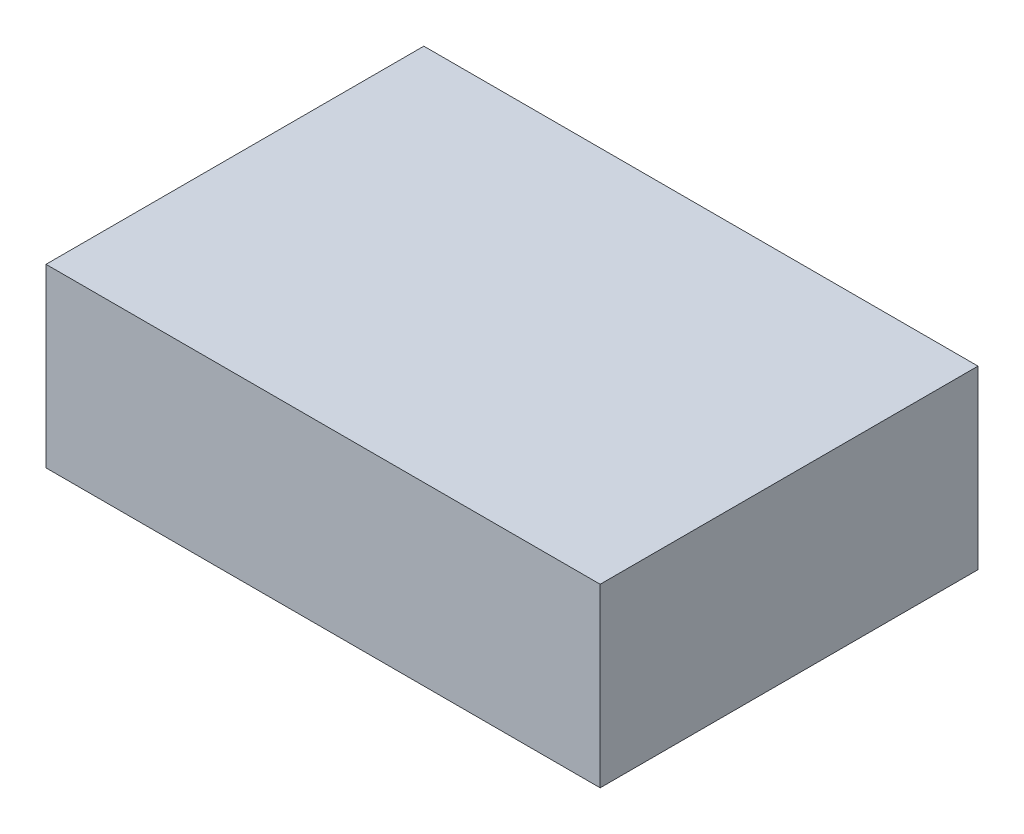
ISO-10303-21;
HEADER;
FILE_DESCRIPTION(('STEP AP214'),'2;1');
FILE_NAME('part.step','',(''),(''),'','','');
FILE_SCHEMA(('AUTOMOTIVE_DESIGN { 1 0 10303 214 1 1 1 1 }'));
ENDSEC;
DATA;
#1=APPLICATION_CONTEXT('core data for automotive mechanical design processes');
#2=APPLICATION_PROTOCOL_DEFINITION('international standard','automotive_design',2000,#1);
#3=PRODUCT_CONTEXT('',#1,'mechanical');
#4=PRODUCT('Part','Part','',(#3));
#5=PRODUCT_RELATED_PRODUCT_CATEGORY('part','',(#4));
#6=PRODUCT_DEFINITION_FORMATION('','',#4);
#7=PRODUCT_DEFINITION_CONTEXT('part definition',#1,'design');
#8=PRODUCT_DEFINITION('design','',#6,#7);
#9=PRODUCT_DEFINITION_SHAPE('','',#8);
#10=(LENGTH_UNIT() NAMED_UNIT(*) SI_UNIT(.MILLI.,.METRE.));
#11=(NAMED_UNIT(*) PLANE_ANGLE_UNIT() SI_UNIT($,.RADIAN.));
#12=(NAMED_UNIT(*) SI_UNIT($,.STERADIAN.) SOLID_ANGLE_UNIT());
#13=UNCERTAINTY_MEASURE_WITH_UNIT(LENGTH_MEASURE(1.E-05),#10,'distance_accuracy_value','');
#14=(GEOMETRIC_REPRESENTATION_CONTEXT(3) GLOBAL_UNCERTAINTY_ASSIGNED_CONTEXT((#13)) GLOBAL_UNIT_ASSIGNED_CONTEXT((#10,
#11,#12)) REPRESENTATION_CONTEXT('',''));
#15=CARTESIAN_POINT('',(0.,0.,0.));
#16=DIRECTION('',(0.,0.,1.));
#17=DIRECTION('',(1.,0.,0.));
#18=AXIS2_PLACEMENT_3D('',#15,#16,#17);
#19=CARTESIAN_POINT('',(-11.,3.5,15.));
#20=DIRECTION('',(1.,0.,0.));
#21=DIRECTION('',(0.,0.,-1.));
#22=AXIS2_PLACEMENT_3D('',#19,#20,#21);
#23=PLANE('',#22);
#24=DIRECTION('',(0.,-1.,0.));
#25=VECTOR('',#24,1.);
#26=CARTESIAN_POINT('',(-11.,3.5,0.));
#27=LINE('',#26,#25);
#28=CARTESIAN_POINT('',(-11.,3.5,0.));
#29=VERTEX_POINT('',#28);
#30=CARTESIAN_POINT('',(-11.,-3.5,0.));
#31=VERTEX_POINT('',#30);
#32=EDGE_CURVE('E100',#29,#31,#27,.T.);
#33=ORIENTED_EDGE('',*,*,#32,.T.);
#34=DIRECTION('',(0.,0.,-1.));
#35=VECTOR('',#34,1.);
#36=CARTESIAN_POINT('',(-11.,-3.5,15.));
#37=LINE('',#36,#35);
#38=CARTESIAN_POINT('',(-11.,-3.5,15.));
#39=VERTEX_POINT('',#38);
#40=EDGE_CURVE('E11',#39,#31,#37,.T.);
#41=ORIENTED_EDGE('',*,*,#40,.F.);
#42=DIRECTION('',(0.,-1.,0.));
#43=VECTOR('',#42,1.);
#44=CARTESIAN_POINT('',(-11.,3.5,15.));
#45=LINE('',#44,#43);
#46=CARTESIAN_POINT('',(-11.,3.5,15.));
#47=VERTEX_POINT('',#46);
#48=EDGE_CURVE('E88',#47,#39,#45,.T.);
#49=ORIENTED_EDGE('',*,*,#48,.F.);
#50=DIRECTION('',(0.,0.,-1.));
#51=VECTOR('',#50,1.);
#52=CARTESIAN_POINT('',(-11.,3.5,15.));
#53=LINE('',#52,#51);
#54=EDGE_CURVE('E96',#47,#29,#53,.T.);
#55=ORIENTED_EDGE('',*,*,#54,.T.);
#56=EDGE_LOOP('',(#33,#41,#49,#55));
#57=FACE_BOUND('',#56,.T.);
#58=ADVANCED_FACE('F37',(#57),#23,.F.);
#59=CARTESIAN_POINT('',(-11.,-3.5,15.));
#60=DIRECTION('',(0.,1.,0.));
#61=DIRECTION('',(0.,0.,1.));
#62=AXIS2_PLACEMENT_3D('',#59,#60,#61);
#63=PLANE('',#62);
#64=DIRECTION('',(1.,0.,0.));
#65=VECTOR('',#64,1.);
#66=CARTESIAN_POINT('',(-11.,-3.5,0.));
#67=LINE('',#66,#65);
#68=CARTESIAN_POINT('',(11.,-3.5,0.));
#69=VERTEX_POINT('',#68);
#70=EDGE_CURVE('E92',#31,#69,#67,.T.);
#71=ORIENTED_EDGE('',*,*,#70,.T.);
#72=DIRECTION('',(0.,0.,-1.));
#73=VECTOR('',#72,1.);
#74=CARTESIAN_POINT('',(11.,-3.5,15.));
#75=LINE('',#74,#73);
#76=CARTESIAN_POINT('',(11.,-3.5,15.));
#77=VERTEX_POINT('',#76);
#78=EDGE_CURVE('E45',#77,#69,#75,.T.);
#79=ORIENTED_EDGE('',*,*,#78,.F.);
#80=DIRECTION('',(1.,0.,0.));
#81=VECTOR('',#80,1.);
#82=CARTESIAN_POINT('',(-11.,-3.5,15.));
#83=LINE('',#82,#81);
#84=EDGE_CURVE('E83',#39,#77,#83,.T.);
#85=ORIENTED_EDGE('',*,*,#84,.F.);
#86=ORIENTED_EDGE('',*,*,#40,.T.);
#87=EDGE_LOOP('',(#71,#79,#85,#86));
#88=FACE_BOUND('',#87,.T.);
#89=ADVANCED_FACE('F91',(#88),#63,.F.);
#90=CARTESIAN_POINT('',(11.,-3.5,15.));
#91=DIRECTION('',(-1.,0.,0.));
#92=DIRECTION('',(0.,0.,1.));
#93=AXIS2_PLACEMENT_3D('',#90,#91,#92);
#94=PLANE('',#93);
#95=DIRECTION('',(0.,1.,0.));
#96=VECTOR('',#95,1.);
#97=CARTESIAN_POINT('',(11.,-3.5,0.));
#98=LINE('',#97,#96);
#99=CARTESIAN_POINT('',(11.,3.5,0.));
#100=VERTEX_POINT('',#99);
#101=EDGE_CURVE('E70',#69,#100,#98,.T.);
#102=ORIENTED_EDGE('',*,*,#101,.T.);
#103=DIRECTION('',(0.,0.,-1.));
#104=VECTOR('',#103,1.);
#105=CARTESIAN_POINT('',(11.,3.5,15.));
#106=LINE('',#105,#104);
#107=CARTESIAN_POINT('',(11.,3.5,15.));
#108=VERTEX_POINT('',#107);
#109=EDGE_CURVE('E93',#108,#100,#106,.T.);
#110=ORIENTED_EDGE('',*,*,#109,.F.);
#111=DIRECTION('',(0.,1.,0.));
#112=VECTOR('',#111,1.);
#113=CARTESIAN_POINT('',(11.,-3.5,15.));
#114=LINE('',#113,#112);
#115=EDGE_CURVE('E86',#77,#108,#114,.T.);
#116=ORIENTED_EDGE('',*,*,#115,.F.);
#117=ORIENTED_EDGE('',*,*,#78,.T.);
#118=EDGE_LOOP('',(#102,#110,#116,#117));
#119=FACE_BOUND('',#118,.T.);
#120=ADVANCED_FACE('F94',(#119),#94,.F.);
#121=CARTESIAN_POINT('',(11.,3.5,15.));
#122=DIRECTION('',(0.,-1.,0.));
#123=DIRECTION('',(0.,0.,-1.));
#124=AXIS2_PLACEMENT_3D('',#121,#122,#123);
#125=PLANE('',#124);
#126=DIRECTION('',(-1.,0.,0.));
#127=VECTOR('',#126,1.);
#128=CARTESIAN_POINT('',(11.,3.5,0.));
#129=LINE('',#128,#127);
#130=EDGE_CURVE('E76',#100,#29,#129,.T.);
#131=ORIENTED_EDGE('',*,*,#130,.T.);
#132=ORIENTED_EDGE('',*,*,#54,.F.);
#133=DIRECTION('',(-1.,0.,0.));
#134=VECTOR('',#133,1.);
#135=CARTESIAN_POINT('',(11.,3.5,15.));
#136=LINE('',#135,#134);
#137=EDGE_CURVE('E53',#108,#47,#136,.T.);
#138=ORIENTED_EDGE('',*,*,#137,.F.);
#139=ORIENTED_EDGE('',*,*,#109,.T.);
#140=EDGE_LOOP('',(#131,#132,#138,#139));
#141=FACE_BOUND('',#140,.T.);
#142=ADVANCED_FACE('F107',(#141),#125,.F.);
#143=CARTESIAN_POINT('',(0.,0.,15.));
#144=DIRECTION('',(0.,0.,1.));
#145=DIRECTION('',(1.,0.,0.));
#146=AXIS2_PLACEMENT_3D('',#143,#144,#145);
#147=PLANE('',#146);
#148=ORIENTED_EDGE('',*,*,#48,.T.);
#149=ORIENTED_EDGE('',*,*,#84,.T.);
#150=ORIENTED_EDGE('',*,*,#115,.T.);
#151=ORIENTED_EDGE('',*,*,#137,.T.);
#152=EDGE_LOOP('',(#148,#149,#150,#151));
#153=FACE_BOUND('',#152,.T.);
#154=ADVANCED_FACE('F84',(#153),#147,.T.);
#155=CARTESIAN_POINT('',(0.,0.,0.));
#156=DIRECTION('',(0.,0.,1.));
#157=DIRECTION('',(1.,0.,0.));
#158=AXIS2_PLACEMENT_3D('',#155,#156,#157);
#159=PLANE('',#158);
#160=ORIENTED_EDGE('',*,*,#32,.F.);
#161=ORIENTED_EDGE('',*,*,#130,.F.);
#162=ORIENTED_EDGE('',*,*,#101,.F.);
#163=ORIENTED_EDGE('',*,*,#70,.F.);
#164=EDGE_LOOP('',(#160,#161,#162,#163));
#165=FACE_BOUND('',#164,.T.);
#166=ADVANCED_FACE('F110',(#165),#159,.F.);
#167=CLOSED_SHELL('',(#58,#89,#120,#142,#154,#166));
#168=MANIFOLD_SOLID_BREP('B2',#167);
#169=ADVANCED_BREP_SHAPE_REPRESENTATION('',(#18,#168),#14);
#170=SHAPE_DEFINITION_REPRESENTATION(#9,#169);
ENDSEC;
END-ISO-10303-21;
